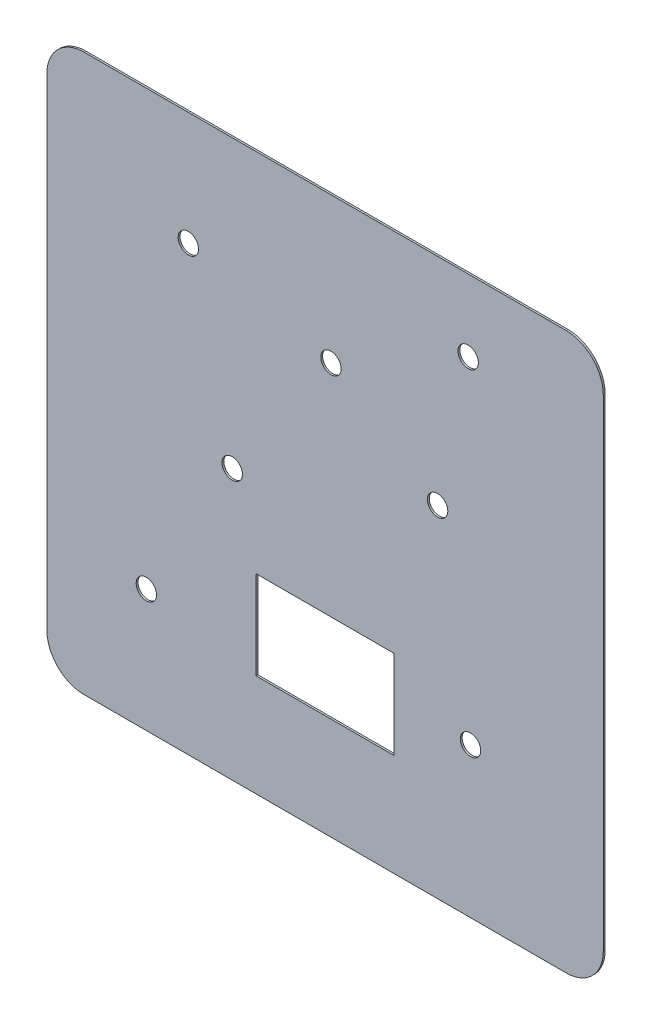
ISO-10303-21;
HEADER;
FILE_DESCRIPTION(('STEP AP214'),'2;1');
FILE_NAME('part.step','',(''),(''),'','','');
FILE_SCHEMA(('AUTOMOTIVE_DESIGN { 1 0 10303 214 1 1 1 1 }'));
ENDSEC;
DATA;
#1=APPLICATION_CONTEXT('core data for automotive mechanical design processes');
#2=APPLICATION_PROTOCOL_DEFINITION('international standard','automotive_design',2000,#1);
#3=PRODUCT_CONTEXT('',#1,'mechanical');
#4=PRODUCT('Part','Part','',(#3));
#5=PRODUCT_RELATED_PRODUCT_CATEGORY('part','',(#4));
#6=PRODUCT_DEFINITION_FORMATION('','',#4);
#7=PRODUCT_DEFINITION_CONTEXT('part definition',#1,'design');
#8=PRODUCT_DEFINITION('design','',#6,#7);
#9=PRODUCT_DEFINITION_SHAPE('','',#8);
#10=(LENGTH_UNIT() NAMED_UNIT(*) SI_UNIT(.MILLI.,.METRE.));
#11=(NAMED_UNIT(*) PLANE_ANGLE_UNIT() SI_UNIT($,.RADIAN.));
#12=(NAMED_UNIT(*) SI_UNIT($,.STERADIAN.) SOLID_ANGLE_UNIT());
#13=UNCERTAINTY_MEASURE_WITH_UNIT(LENGTH_MEASURE(1.E-05),#10,'distance_accuracy_value','');
#14=(GEOMETRIC_REPRESENTATION_CONTEXT(3) GLOBAL_UNCERTAINTY_ASSIGNED_CONTEXT((#13)) GLOBAL_UNIT_ASSIGNED_CONTEXT((#10,
#11,#12)) REPRESENTATION_CONTEXT('',''));
#15=CARTESIAN_POINT('',(0.,0.,0.));
#16=DIRECTION('',(0.,0.,1.));
#17=DIRECTION('',(1.,0.,0.));
#18=AXIS2_PLACEMENT_3D('',#15,#16,#17);
#19=CARTESIAN_POINT('',(75.,75.,0.5));
#20=DIRECTION('',(-1.,0.,0.));
#21=DIRECTION('',(0.,-1.,0.));
#22=AXIS2_PLACEMENT_3D('',#19,#20,#21);
#23=PLANE('',#22);
#24=DIRECTION('',(0.,1.,0.));
#25=VECTOR('',#24,1.);
#26=CARTESIAN_POINT('',(75.,75.,0.5));
#27=LINE('',#26,#25);
#28=CARTESIAN_POINT('',(75.,-65.,0.5));
#29=VERTEX_POINT('',#28);
#30=CARTESIAN_POINT('',(75.,65.,0.5));
#31=VERTEX_POINT('',#30);
#32=EDGE_CURVE('E221',#29,#31,#27,.T.);
#33=ORIENTED_EDGE('',*,*,#32,.F.);
#34=DIRECTION('',(0.,0.,-1.));
#35=VECTOR('',#34,1.);
#36=CARTESIAN_POINT('',(75.,-65.,0.5));
#37=LINE('',#36,#35);
#38=CARTESIAN_POINT('',(75.,-65.,0.));
#39=VERTEX_POINT('',#38);
#40=EDGE_CURVE('E255',#29,#39,#37,.T.);
#41=ORIENTED_EDGE('',*,*,#40,.T.);
#42=DIRECTION('',(0.,1.,0.));
#43=VECTOR('',#42,1.);
#44=CARTESIAN_POINT('',(75.,75.,0.));
#45=LINE('',#44,#43);
#46=CARTESIAN_POINT('',(75.,65.,0.));
#47=VERTEX_POINT('',#46);
#48=EDGE_CURVE('E220',#39,#47,#45,.T.);
#49=ORIENTED_EDGE('',*,*,#48,.T.);
#50=DIRECTION('',(0.,0.,-1.));
#51=VECTOR('',#50,1.);
#52=CARTESIAN_POINT('',(75.,65.,0.5));
#53=LINE('',#52,#51);
#54=EDGE_CURVE('E238',#47,#31,#53,.F.);
#55=ORIENTED_EDGE('',*,*,#54,.T.);
#56=EDGE_LOOP('',(#33,#41,#49,#55));
#57=FACE_BOUND('',#56,.T.);
#58=ADVANCED_FACE('F39',(#57),#23,.F.);
#59=CARTESIAN_POINT('',(-75.,75.,0.5));
#60=DIRECTION('',(0.,-1.,0.));
#61=DIRECTION('',(0.,0.,-1.));
#62=AXIS2_PLACEMENT_3D('',#59,#60,#61);
#63=PLANE('',#62);
#64=DIRECTION('',(-1.,0.,0.));
#65=VECTOR('',#64,1.);
#66=CARTESIAN_POINT('',(-75.,75.,0.));
#67=LINE('',#66,#65);
#68=CARTESIAN_POINT('',(65.,75.,0.));
#69=VERTEX_POINT('',#68);
#70=CARTESIAN_POINT('',(-65.,75.,0.));
#71=VERTEX_POINT('',#70);
#72=EDGE_CURVE('E242',#69,#71,#67,.T.);
#73=ORIENTED_EDGE('',*,*,#72,.T.);
#74=DIRECTION('',(0.,0.,-1.));
#75=VECTOR('',#74,1.);
#76=CARTESIAN_POINT('',(-65.,75.,0.5));
#77=LINE('',#76,#75);
#78=CARTESIAN_POINT('',(-65.,75.,0.5));
#79=VERTEX_POINT('',#78);
#80=EDGE_CURVE('E301',#71,#79,#77,.F.);
#81=ORIENTED_EDGE('',*,*,#80,.T.);
#82=DIRECTION('',(-1.,0.,0.));
#83=VECTOR('',#82,1.);
#84=CARTESIAN_POINT('',(-75.,75.,0.5));
#85=LINE('',#84,#83);
#86=CARTESIAN_POINT('',(65.,75.,0.5));
#87=VERTEX_POINT('',#86);
#88=EDGE_CURVE('E225',#87,#79,#85,.T.);
#89=ORIENTED_EDGE('',*,*,#88,.F.);
#90=DIRECTION('',(0.,0.,-1.));
#91=VECTOR('',#90,1.);
#92=CARTESIAN_POINT('',(65.,75.,0.5));
#93=LINE('',#92,#91);
#94=EDGE_CURVE('E297',#87,#69,#93,.T.);
#95=ORIENTED_EDGE('',*,*,#94,.T.);
#96=EDGE_LOOP('',(#73,#81,#89,#95));
#97=FACE_BOUND('',#96,.T.);
#98=ADVANCED_FACE('F330',(#97),#63,.F.);
#99=CARTESIAN_POINT('',(-75.,75.,0.5));
#100=DIRECTION('',(1.,0.,0.));
#101=DIRECTION('',(0.,0.,-1.));
#102=AXIS2_PLACEMENT_3D('',#99,#100,#101);
#103=PLANE('',#102);
#104=DIRECTION('',(0.,-1.,0.));
#105=VECTOR('',#104,1.);
#106=CARTESIAN_POINT('',(-75.,75.,0.));
#107=LINE('',#106,#105);
#108=CARTESIAN_POINT('',(-75.,65.,0.));
#109=VERTEX_POINT('',#108);
#110=CARTESIAN_POINT('',(-75.,-65.,0.));
#111=VERTEX_POINT('',#110);
#112=EDGE_CURVE('E246',#109,#111,#107,.T.);
#113=ORIENTED_EDGE('',*,*,#112,.T.);
#114=DIRECTION('',(0.,0.,-1.));
#115=VECTOR('',#114,1.);
#116=CARTESIAN_POINT('',(-75.,-65.,0.5));
#117=LINE('',#116,#115);
#118=CARTESIAN_POINT('',(-75.,-65.,0.5));
#119=VERTEX_POINT('',#118);
#120=EDGE_CURVE('E294',#111,#119,#117,.F.);
#121=ORIENTED_EDGE('',*,*,#120,.T.);
#122=DIRECTION('',(0.,-1.,0.));
#123=VECTOR('',#122,1.);
#124=CARTESIAN_POINT('',(-75.,75.,0.5));
#125=LINE('',#124,#123);
#126=CARTESIAN_POINT('',(-75.,65.,0.5));
#127=VERTEX_POINT('',#126);
#128=EDGE_CURVE('E230',#127,#119,#125,.T.);
#129=ORIENTED_EDGE('',*,*,#128,.F.);
#130=DIRECTION('',(0.,0.,-1.));
#131=VECTOR('',#130,1.);
#132=CARTESIAN_POINT('',(-75.,65.,0.5));
#133=LINE('',#132,#131);
#134=EDGE_CURVE('E290',#127,#109,#133,.T.);
#135=ORIENTED_EDGE('',*,*,#134,.T.);
#136=EDGE_LOOP('',(#113,#121,#129,#135));
#137=FACE_BOUND('',#136,.T.);
#138=ADVANCED_FACE('F336',(#137),#103,.F.);
#139=CARTESIAN_POINT('',(-75.,-75.,0.5));
#140=DIRECTION('',(0.,1.,0.));
#141=DIRECTION('',(0.,0.,1.));
#142=AXIS2_PLACEMENT_3D('',#139,#140,#141);
#143=PLANE('',#142);
#144=DIRECTION('',(1.,0.,0.));
#145=VECTOR('',#144,1.);
#146=CARTESIAN_POINT('',(-75.,-75.,0.));
#147=LINE('',#146,#145);
#148=CARTESIAN_POINT('',(-65.,-75.,0.));
#149=VERTEX_POINT('',#148);
#150=CARTESIAN_POINT('',(65.,-75.,0.));
#151=VERTEX_POINT('',#150);
#152=EDGE_CURVE('E226',#149,#151,#147,.T.);
#153=ORIENTED_EDGE('',*,*,#152,.T.);
#154=DIRECTION('',(0.,0.,-1.));
#155=VECTOR('',#154,1.);
#156=CARTESIAN_POINT('',(65.,-75.,0.5));
#157=LINE('',#156,#155);
#158=CARTESIAN_POINT('',(65.,-75.,0.5));
#159=VERTEX_POINT('',#158);
#160=EDGE_CURVE('E275',#151,#159,#157,.F.);
#161=ORIENTED_EDGE('',*,*,#160,.T.);
#162=DIRECTION('',(1.,0.,0.));
#163=VECTOR('',#162,1.);
#164=CARTESIAN_POINT('',(-75.,-75.,0.5));
#165=LINE('',#164,#163);
#166=CARTESIAN_POINT('',(-65.,-75.,0.5));
#167=VERTEX_POINT('',#166);
#168=EDGE_CURVE('E234',#167,#159,#165,.T.);
#169=ORIENTED_EDGE('',*,*,#168,.F.);
#170=DIRECTION('',(0.,0.,-1.));
#171=VECTOR('',#170,1.);
#172=CARTESIAN_POINT('',(-65.,-75.,0.5));
#173=LINE('',#172,#171);
#174=EDGE_CURVE('E271',#167,#149,#173,.T.);
#175=ORIENTED_EDGE('',*,*,#174,.T.);
#176=EDGE_LOOP('',(#153,#161,#169,#175));
#177=FACE_BOUND('',#176,.T.);
#178=ADVANCED_FACE('F371',(#177),#143,.F.);
#179=CARTESIAN_POINT('',(0.,0.,0.5));
#180=DIRECTION('',(0.,0.,1.));
#181=DIRECTION('',(1.,0.,0.));
#182=AXIS2_PLACEMENT_3D('',#179,#180,#181);
#183=PLANE('',#182);
#184=DIRECTION('',(0.,1.,0.));
#185=VECTOR('',#184,1.);
#186=CARTESIAN_POINT('',(18.5921824981392,-47.4298792805712,0.5));
#187=LINE('',#186,#185);
#188=CARTESIAN_POINT('',(18.5921824981392,-47.4298792805712,0.5));
#189=VERTEX_POINT('',#188);
#190=CARTESIAN_POINT('',(18.5921824981392,-23.5807429139641,0.5));
#191=VERTEX_POINT('',#190);
#192=EDGE_CURVE('E55',#189,#191,#187,.T.);
#193=ORIENTED_EDGE('',*,*,#192,.F.);
#194=DIRECTION('',(1.,0.,0.));
#195=VECTOR('',#194,1.);
#196=CARTESIAN_POINT('',(-18.5921824981392,-47.4298792805712,0.5));
#197=LINE('',#196,#195);
#198=CARTESIAN_POINT('',(-18.5921824981392,-47.4298792805712,0.5));
#199=VERTEX_POINT('',#198);
#200=EDGE_CURVE('E150',#199,#189,#197,.T.);
#201=ORIENTED_EDGE('',*,*,#200,.F.);
#202=DIRECTION('',(0.,-1.,0.));
#203=VECTOR('',#202,1.);
#204=CARTESIAN_POINT('',(-18.5921824981392,-47.4298792805712,0.5));
#205=LINE('',#204,#203);
#206=CARTESIAN_POINT('',(-18.5921824981392,-23.5807429139641,0.5));
#207=VERTEX_POINT('',#206);
#208=EDGE_CURVE('E132',#207,#199,#205,.T.);
#209=ORIENTED_EDGE('',*,*,#208,.F.);
#210=DIRECTION('',(-1.,0.,0.));
#211=VECTOR('',#210,1.);
#212=CARTESIAN_POINT('',(-18.5921824981392,-23.5807429139641,0.5));
#213=LINE('',#212,#211);
#214=EDGE_CURVE('E142',#191,#207,#213,.T.);
#215=ORIENTED_EDGE('',*,*,#214,.F.);
#216=EDGE_LOOP('',(#193,#201,#209,#215));
#217=FACE_BOUND('',#216,.T.);
#218=CARTESIAN_POINT('',(-48.1796937595207,-41.9661545299378,0.500000000000001));
#219=DIRECTION('',(0.,0.,1.));
#220=DIRECTION('',(1.,0.,0.));
#221=AXIS2_PLACEMENT_3D('',#218,#219,#220);
#222=CIRCLE('',#221,2.75);
#223=CARTESIAN_POINT('',(-45.4296937595207,-41.9661545299378,0.500000000000001));
#224=VERTEX_POINT('',#223);
#225=EDGE_CURVE('E160',#224,#224,#222,.T.);
#226=ORIENTED_EDGE('',*,*,#225,.F.);
#227=EDGE_LOOP('',(#226));
#228=FACE_BOUND('',#227,.T.);
#229=CARTESIAN_POINT('',(-25.0340979424366,-2.22101942156186,0.500000000000001));
#230=DIRECTION('',(0.,0.,1.));
#231=DIRECTION('',(1.,0.,0.));
#232=AXIS2_PLACEMENT_3D('',#229,#230,#231);
#233=CIRCLE('',#232,2.75);
#234=CARTESIAN_POINT('',(-22.2840979424366,-2.22101942156186,0.500000000000001));
#235=VERTEX_POINT('',#234);
#236=EDGE_CURVE('E172',#235,#235,#233,.T.);
#237=ORIENTED_EDGE('',*,*,#236,.F.);
#238=EDGE_LOOP('',(#237));
#239=FACE_BOUND('',#238,.T.);
#240=CARTESIAN_POINT('',(30.3364611623649,16.858043097251,0.500000000000001));
#241=DIRECTION('',(0.,0.,1.));
#242=DIRECTION('',(1.,0.,0.));
#243=AXIS2_PLACEMENT_3D('',#240,#241,#242);
#244=CIRCLE('',#243,2.75);
#245=CARTESIAN_POINT('',(33.0864611623649,16.858043097251,0.500000000000001));
#246=VERTEX_POINT('',#245);
#247=EDGE_CURVE('E180',#246,#246,#244,.T.);
#248=ORIENTED_EDGE('',*,*,#247,.F.);
#249=EDGE_LOOP('',(#248));
#250=FACE_BOUND('',#249,.T.);
#251=CARTESIAN_POINT('',(39.210967362949,-34.6065465610296,0.500000000000001));
#252=DIRECTION('',(0.,0.,1.));
#253=DIRECTION('',(1.,0.,0.));
#254=AXIS2_PLACEMENT_3D('',#251,#252,#253);
#255=CIRCLE('',#254,2.75);
#256=CARTESIAN_POINT('',(41.960967362949,-34.6065465610296,0.500000000000001));
#257=VERTEX_POINT('',#256);
#258=EDGE_CURVE('E188',#257,#257,#255,.T.);
#259=ORIENTED_EDGE('',*,*,#258,.F.);
#260=EDGE_LOOP('',(#259));
#261=FACE_BOUND('',#260,.T.);
#262=CARTESIAN_POINT('',(-36.8661176924818,44.4433466472346,0.500000000000001));
#263=DIRECTION('',(0.,0.,1.));
#264=DIRECTION('',(1.,0.,0.));
#265=AXIS2_PLACEMENT_3D('',#262,#263,#264);
#266=CIRCLE('',#265,2.75);
#267=CARTESIAN_POINT('',(-34.1161176924819,44.4433466472346,0.500000000000001));
#268=VERTEX_POINT('',#267);
#269=EDGE_CURVE('E196',#268,#268,#266,.T.);
#270=ORIENTED_EDGE('',*,*,#269,.F.);
#271=EDGE_LOOP('',(#270));
#272=FACE_BOUND('',#271,.T.);
#273=CARTESIAN_POINT('',(38.5847843878379,55.638432616753,0.500000000000001));
#274=DIRECTION('',(0.,0.,1.));
#275=DIRECTION('',(1.,0.,0.));
#276=AXIS2_PLACEMENT_3D('',#273,#274,#275);
#277=CIRCLE('',#276,2.75);
#278=CARTESIAN_POINT('',(41.3347843878379,55.638432616753,0.500000000000001));
#279=VERTEX_POINT('',#278);
#280=EDGE_CURVE('E204',#279,#279,#277,.T.);
#281=ORIENTED_EDGE('',*,*,#280,.F.);
#282=EDGE_LOOP('',(#281));
#283=FACE_BOUND('',#282,.T.);
#284=CARTESIAN_POINT('',(1.58293415168618,35.7251932066232,0.500000000000001));
#285=DIRECTION('',(0.,0.,1.));
#286=DIRECTION('',(1.,0.,0.));
#287=AXIS2_PLACEMENT_3D('',#284,#285,#286);
#288=CIRCLE('',#287,2.75);
#289=CARTESIAN_POINT('',(4.33293415168618,35.7251932066232,0.500000000000001));
#290=VERTEX_POINT('',#289);
#291=EDGE_CURVE('E212',#290,#290,#288,.T.);
#292=ORIENTED_EDGE('',*,*,#291,.F.);
#293=EDGE_LOOP('',(#292));
#294=FACE_BOUND('',#293,.T.);
#295=ORIENTED_EDGE('',*,*,#168,.T.);
#296=CARTESIAN_POINT('',(65.,-65.,0.5));
#297=DIRECTION('',(0.,0.,1.));
#298=DIRECTION('',(1.,0.,0.));
#299=AXIS2_PLACEMENT_3D('',#296,#297,#298);
#300=CIRCLE('',#299,10.);
#301=EDGE_CURVE('E287',#159,#29,#300,.T.);
#302=ORIENTED_EDGE('',*,*,#301,.T.);
#303=ORIENTED_EDGE('',*,*,#32,.T.);
#304=CARTESIAN_POINT('',(65.,65.,0.5));
#305=DIRECTION('',(0.,0.,1.));
#306=DIRECTION('',(1.,0.,0.));
#307=AXIS2_PLACEMENT_3D('',#304,#305,#306);
#308=CIRCLE('',#307,10.);
#309=EDGE_CURVE('E278',#31,#87,#308,.T.);
#310=ORIENTED_EDGE('',*,*,#309,.T.);
#311=ORIENTED_EDGE('',*,*,#88,.T.);
#312=CARTESIAN_POINT('',(-65.,65.,0.5));
#313=DIRECTION('',(0.,0.,1.));
#314=DIRECTION('',(1.,0.,0.));
#315=AXIS2_PLACEMENT_3D('',#312,#313,#314);
#316=CIRCLE('',#315,10.);
#317=EDGE_CURVE('E281',#79,#127,#316,.T.);
#318=ORIENTED_EDGE('',*,*,#317,.T.);
#319=ORIENTED_EDGE('',*,*,#128,.T.);
#320=CARTESIAN_POINT('',(-65.,-65.,0.5));
#321=DIRECTION('',(0.,0.,1.));
#322=DIRECTION('',(1.,0.,0.));
#323=AXIS2_PLACEMENT_3D('',#320,#321,#322);
#324=CIRCLE('',#323,10.);
#325=EDGE_CURVE('E284',#119,#167,#324,.T.);
#326=ORIENTED_EDGE('',*,*,#325,.T.);
#327=EDGE_LOOP('',(#295,#302,#303,#310,#311,#318,#319,#326));
#328=FACE_BOUND('',#327,.T.);
#329=ADVANCED_FACE('F147',(#217,#228,#239,#250,#261,#272,#283,#294,#328),#183,.T.);
#330=CARTESIAN_POINT('',(0.,0.,0.));
#331=DIRECTION('',(0.,0.,1.));
#332=DIRECTION('',(1.,0.,0.));
#333=AXIS2_PLACEMENT_3D('',#330,#331,#332);
#334=PLANE('',#333);
#335=DIRECTION('',(1.,0.,0.));
#336=VECTOR('',#335,1.);
#337=CARTESIAN_POINT('',(0.,-47.4298792805712,0.));
#338=LINE('',#337,#336);
#339=CARTESIAN_POINT('',(-18.5921824981392,-47.4298792805712,0.));
#340=VERTEX_POINT('',#339);
#341=CARTESIAN_POINT('',(18.5921824981392,-47.4298792805712,0.));
#342=VERTEX_POINT('',#341);
#343=EDGE_CURVE('E48',#340,#342,#338,.T.);
#344=ORIENTED_EDGE('',*,*,#343,.T.);
#345=DIRECTION('',(0.,1.,0.));
#346=VECTOR('',#345,1.);
#347=CARTESIAN_POINT('',(18.5921824981392,0.,0.));
#348=LINE('',#347,#346);
#349=CARTESIAN_POINT('',(18.5921824981392,-23.5807429139641,0.));
#350=VERTEX_POINT('',#349);
#351=EDGE_CURVE('E11',#342,#350,#348,.T.);
#352=ORIENTED_EDGE('',*,*,#351,.T.);
#353=DIRECTION('',(-1.,0.,0.));
#354=VECTOR('',#353,1.);
#355=CARTESIAN_POINT('',(0.,-23.5807429139641,0.));
#356=LINE('',#355,#354);
#357=CARTESIAN_POINT('',(-18.5921824981392,-23.5807429139641,0.));
#358=VERTEX_POINT('',#357);
#359=EDGE_CURVE('E304',#350,#358,#356,.T.);
#360=ORIENTED_EDGE('',*,*,#359,.T.);
#361=DIRECTION('',(0.,-1.,0.));
#362=VECTOR('',#361,1.);
#363=CARTESIAN_POINT('',(-18.5921824981392,0.,0.));
#364=LINE('',#363,#362);
#365=EDGE_CURVE('E135',#358,#340,#364,.T.);
#366=ORIENTED_EDGE('',*,*,#365,.T.);
#367=EDGE_LOOP('',(#344,#352,#360,#366));
#368=FACE_BOUND('',#367,.T.);
#369=CARTESIAN_POINT('',(-48.1796937595207,-41.9661545299378,0.));
#370=DIRECTION('',(0.,0.,1.));
#371=DIRECTION('',(1.,0.,0.));
#372=AXIS2_PLACEMENT_3D('',#369,#370,#371);
#373=CIRCLE('',#372,2.75);
#374=CARTESIAN_POINT('',(-45.4296937595207,-41.9661545299378,0.));
#375=VERTEX_POINT('',#374);
#376=EDGE_CURVE('E168',#375,#375,#373,.T.);
#377=ORIENTED_EDGE('',*,*,#376,.T.);
#378=EDGE_LOOP('',(#377));
#379=FACE_BOUND('',#378,.T.);
#380=CARTESIAN_POINT('',(-25.0340979424366,-2.22101942156186,0.));
#381=DIRECTION('',(0.,0.,1.));
#382=DIRECTION('',(1.,0.,0.));
#383=AXIS2_PLACEMENT_3D('',#380,#381,#382);
#384=CIRCLE('',#383,2.75);
#385=CARTESIAN_POINT('',(-22.2840979424366,-2.22101942156186,0.));
#386=VERTEX_POINT('',#385);
#387=EDGE_CURVE('E176',#386,#386,#384,.T.);
#388=ORIENTED_EDGE('',*,*,#387,.T.);
#389=EDGE_LOOP('',(#388));
#390=FACE_BOUND('',#389,.T.);
#391=CARTESIAN_POINT('',(30.3364611623649,16.858043097251,0.));
#392=DIRECTION('',(0.,0.,1.));
#393=DIRECTION('',(1.,0.,0.));
#394=AXIS2_PLACEMENT_3D('',#391,#392,#393);
#395=CIRCLE('',#394,2.75);
#396=CARTESIAN_POINT('',(33.0864611623649,16.858043097251,0.));
#397=VERTEX_POINT('',#396);
#398=EDGE_CURVE('E184',#397,#397,#395,.T.);
#399=ORIENTED_EDGE('',*,*,#398,.T.);
#400=EDGE_LOOP('',(#399));
#401=FACE_BOUND('',#400,.T.);
#402=CARTESIAN_POINT('',(39.210967362949,-34.6065465610296,0.));
#403=DIRECTION('',(0.,0.,1.));
#404=DIRECTION('',(1.,0.,0.));
#405=AXIS2_PLACEMENT_3D('',#402,#403,#404);
#406=CIRCLE('',#405,2.75);
#407=CARTESIAN_POINT('',(41.960967362949,-34.6065465610296,0.));
#408=VERTEX_POINT('',#407);
#409=EDGE_CURVE('E192',#408,#408,#406,.T.);
#410=ORIENTED_EDGE('',*,*,#409,.T.);
#411=EDGE_LOOP('',(#410));
#412=FACE_BOUND('',#411,.T.);
#413=CARTESIAN_POINT('',(-36.8661176924818,44.4433466472346,0.));
#414=DIRECTION('',(0.,0.,1.));
#415=DIRECTION('',(1.,0.,0.));
#416=AXIS2_PLACEMENT_3D('',#413,#414,#415);
#417=CIRCLE('',#416,2.75);
#418=CARTESIAN_POINT('',(-34.1161176924818,44.4433466472346,0.));
#419=VERTEX_POINT('',#418);
#420=EDGE_CURVE('E200',#419,#419,#417,.T.);
#421=ORIENTED_EDGE('',*,*,#420,.T.);
#422=EDGE_LOOP('',(#421));
#423=FACE_BOUND('',#422,.T.);
#424=CARTESIAN_POINT('',(38.5847843878379,55.638432616753,0.));
#425=DIRECTION('',(0.,0.,1.));
#426=DIRECTION('',(1.,0.,0.));
#427=AXIS2_PLACEMENT_3D('',#424,#425,#426);
#428=CIRCLE('',#427,2.75);
#429=CARTESIAN_POINT('',(41.3347843878379,55.638432616753,0.));
#430=VERTEX_POINT('',#429);
#431=EDGE_CURVE('E208',#430,#430,#428,.T.);
#432=ORIENTED_EDGE('',*,*,#431,.T.);
#433=EDGE_LOOP('',(#432));
#434=FACE_BOUND('',#433,.T.);
#435=CARTESIAN_POINT('',(1.58293415168618,35.7251932066232,0.));
#436=DIRECTION('',(0.,0.,1.));
#437=DIRECTION('',(1.,0.,0.));
#438=AXIS2_PLACEMENT_3D('',#435,#436,#437);
#439=CIRCLE('',#438,2.75);
#440=CARTESIAN_POINT('',(4.33293415168618,35.7251932066232,0.));
#441=VERTEX_POINT('',#440);
#442=EDGE_CURVE('E216',#441,#441,#439,.T.);
#443=ORIENTED_EDGE('',*,*,#442,.T.);
#444=EDGE_LOOP('',(#443));
#445=FACE_BOUND('',#444,.T.);
#446=ORIENTED_EDGE('',*,*,#48,.F.);
#447=CARTESIAN_POINT('',(65.,-65.,0.));
#448=DIRECTION('',(0.,0.,1.));
#449=DIRECTION('',(1.,0.,0.));
#450=AXIS2_PLACEMENT_3D('',#447,#448,#449);
#451=CIRCLE('',#450,10.);
#452=EDGE_CURVE('E268',#39,#151,#451,.F.);
#453=ORIENTED_EDGE('',*,*,#452,.T.);
#454=ORIENTED_EDGE('',*,*,#152,.F.);
#455=CARTESIAN_POINT('',(-65.,-65.,0.));
#456=DIRECTION('',(0.,0.,1.));
#457=DIRECTION('',(1.,0.,0.));
#458=AXIS2_PLACEMENT_3D('',#455,#456,#457);
#459=CIRCLE('',#458,10.);
#460=EDGE_CURVE('E265',#149,#111,#459,.F.);
#461=ORIENTED_EDGE('',*,*,#460,.T.);
#462=ORIENTED_EDGE('',*,*,#112,.F.);
#463=CARTESIAN_POINT('',(-65.,65.,0.));
#464=DIRECTION('',(0.,0.,1.));
#465=DIRECTION('',(1.,0.,0.));
#466=AXIS2_PLACEMENT_3D('',#463,#464,#465);
#467=CIRCLE('',#466,10.);
#468=EDGE_CURVE('E262',#109,#71,#467,.F.);
#469=ORIENTED_EDGE('',*,*,#468,.T.);
#470=ORIENTED_EDGE('',*,*,#72,.F.);
#471=CARTESIAN_POINT('',(65.,65.,0.));
#472=DIRECTION('',(0.,0.,1.));
#473=DIRECTION('',(1.,0.,0.));
#474=AXIS2_PLACEMENT_3D('',#471,#472,#473);
#475=CIRCLE('',#474,10.);
#476=EDGE_CURVE('E259',#69,#47,#475,.F.);
#477=ORIENTED_EDGE('',*,*,#476,.T.);
#478=EDGE_LOOP('',(#446,#453,#454,#461,#462,#469,#470,#477));
#479=FACE_BOUND('',#478,.T.);
#480=ADVANCED_FACE('F311',(#368,#379,#390,#401,#412,#423,#434,#445,#479),#334,.F.);
#481=CARTESIAN_POINT('',(65.,-65.,0.5));
#482=DIRECTION('',(0.,0.,-1.));
#483=DIRECTION('',(-1.,0.,0.));
#484=AXIS2_PLACEMENT_3D('',#481,#482,#483);
#485=CYLINDRICAL_SURFACE('',#484,10.);
#486=ORIENTED_EDGE('',*,*,#301,.F.);
#487=ORIENTED_EDGE('',*,*,#160,.F.);
#488=ORIENTED_EDGE('',*,*,#452,.F.);
#489=ORIENTED_EDGE('',*,*,#40,.F.);
#490=EDGE_LOOP('',(#486,#487,#488,#489));
#491=FACE_BOUND('',#490,.T.);
#492=ADVANCED_FACE('F342',(#491),#485,.T.);
#493=CARTESIAN_POINT('',(-65.,-65.,0.5));
#494=DIRECTION('',(0.,0.,-1.));
#495=DIRECTION('',(-1.,0.,0.));
#496=AXIS2_PLACEMENT_3D('',#493,#494,#495);
#497=CYLINDRICAL_SURFACE('',#496,10.);
#498=ORIENTED_EDGE('',*,*,#325,.F.);
#499=ORIENTED_EDGE('',*,*,#120,.F.);
#500=ORIENTED_EDGE('',*,*,#460,.F.);
#501=ORIENTED_EDGE('',*,*,#174,.F.);
#502=EDGE_LOOP('',(#498,#499,#500,#501));
#503=FACE_BOUND('',#502,.T.);
#504=ADVANCED_FACE('F345',(#503),#497,.T.);
#505=CARTESIAN_POINT('',(-65.,65.,0.5));
#506=DIRECTION('',(0.,0.,-1.));
#507=DIRECTION('',(-1.,0.,0.));
#508=AXIS2_PLACEMENT_3D('',#505,#506,#507);
#509=CYLINDRICAL_SURFACE('',#508,10.);
#510=ORIENTED_EDGE('',*,*,#317,.F.);
#511=ORIENTED_EDGE('',*,*,#80,.F.);
#512=ORIENTED_EDGE('',*,*,#468,.F.);
#513=ORIENTED_EDGE('',*,*,#134,.F.);
#514=EDGE_LOOP('',(#510,#511,#512,#513));
#515=FACE_BOUND('',#514,.T.);
#516=ADVANCED_FACE('F348',(#515),#509,.T.);
#517=CARTESIAN_POINT('',(65.,65.,0.5));
#518=DIRECTION('',(0.,0.,-1.));
#519=DIRECTION('',(-1.,0.,0.));
#520=AXIS2_PLACEMENT_3D('',#517,#518,#519);
#521=CYLINDRICAL_SURFACE('',#520,10.);
#522=ORIENTED_EDGE('',*,*,#309,.F.);
#523=ORIENTED_EDGE('',*,*,#54,.F.);
#524=ORIENTED_EDGE('',*,*,#476,.F.);
#525=ORIENTED_EDGE('',*,*,#94,.F.);
#526=EDGE_LOOP('',(#522,#523,#524,#525));
#527=FACE_BOUND('',#526,.T.);
#528=ADVANCED_FACE('F41',(#527),#521,.T.);
#529=CARTESIAN_POINT('',(1.58293415168618,35.7251932066232,0.5));
#530=DIRECTION('',(0.,0.,1.));
#531=DIRECTION('',(1.,0.,0.));
#532=AXIS2_PLACEMENT_3D('',#529,#530,#531);
#533=CYLINDRICAL_SURFACE('',#532,2.75);
#534=ORIENTED_EDGE('',*,*,#442,.F.);
#535=EDGE_LOOP('',(#534));
#536=FACE_BOUND('',#535,.T.);
#537=ORIENTED_EDGE('',*,*,#291,.T.);
#538=EDGE_LOOP('',(#537));
#539=FACE_BOUND('',#538,.T.);
#540=ADVANCED_FACE('F355',(#536,#539),#533,.F.);
#541=CARTESIAN_POINT('',(38.5847843878379,55.638432616753,0.5));
#542=DIRECTION('',(0.,0.,1.));
#543=DIRECTION('',(1.,0.,0.));
#544=AXIS2_PLACEMENT_3D('',#541,#542,#543);
#545=CYLINDRICAL_SURFACE('',#544,2.75);
#546=ORIENTED_EDGE('',*,*,#431,.F.);
#547=EDGE_LOOP('',(#546));
#548=FACE_BOUND('',#547,.T.);
#549=ORIENTED_EDGE('',*,*,#280,.T.);
#550=EDGE_LOOP('',(#549));
#551=FACE_BOUND('',#550,.T.);
#552=ADVANCED_FACE('F476',(#548,#551),#545,.F.);
#553=CARTESIAN_POINT('',(-36.8661176924818,44.4433466472346,0.5));
#554=DIRECTION('',(0.,0.,1.));
#555=DIRECTION('',(1.,0.,0.));
#556=AXIS2_PLACEMENT_3D('',#553,#554,#555);
#557=CYLINDRICAL_SURFACE('',#556,2.75);
#558=ORIENTED_EDGE('',*,*,#420,.F.);
#559=EDGE_LOOP('',(#558));
#560=FACE_BOUND('',#559,.T.);
#561=ORIENTED_EDGE('',*,*,#269,.T.);
#562=EDGE_LOOP('',(#561));
#563=FACE_BOUND('',#562,.T.);
#564=ADVANCED_FACE('F467',(#560,#563),#557,.F.);
#565=CARTESIAN_POINT('',(39.210967362949,-34.6065465610296,0.5));
#566=DIRECTION('',(0.,0.,1.));
#567=DIRECTION('',(1.,0.,0.));
#568=AXIS2_PLACEMENT_3D('',#565,#566,#567);
#569=CYLINDRICAL_SURFACE('',#568,2.75);
#570=ORIENTED_EDGE('',*,*,#409,.F.);
#571=EDGE_LOOP('',(#570));
#572=FACE_BOUND('',#571,.T.);
#573=ORIENTED_EDGE('',*,*,#258,.T.);
#574=EDGE_LOOP('',(#573));
#575=FACE_BOUND('',#574,.T.);
#576=ADVANCED_FACE('F458',(#572,#575),#569,.F.);
#577=CARTESIAN_POINT('',(30.3364611623649,16.858043097251,0.5));
#578=DIRECTION('',(0.,0.,1.));
#579=DIRECTION('',(1.,0.,0.));
#580=AXIS2_PLACEMENT_3D('',#577,#578,#579);
#581=CYLINDRICAL_SURFACE('',#580,2.75);
#582=ORIENTED_EDGE('',*,*,#398,.F.);
#583=EDGE_LOOP('',(#582));
#584=FACE_BOUND('',#583,.T.);
#585=ORIENTED_EDGE('',*,*,#247,.T.);
#586=EDGE_LOOP('',(#585));
#587=FACE_BOUND('',#586,.T.);
#588=ADVANCED_FACE('F449',(#584,#587),#581,.F.);
#589=CARTESIAN_POINT('',(-25.0340979424366,-2.22101942156186,0.5));
#590=DIRECTION('',(0.,0.,1.));
#591=DIRECTION('',(1.,0.,0.));
#592=AXIS2_PLACEMENT_3D('',#589,#590,#591);
#593=CYLINDRICAL_SURFACE('',#592,2.75);
#594=ORIENTED_EDGE('',*,*,#387,.F.);
#595=EDGE_LOOP('',(#594));
#596=FACE_BOUND('',#595,.T.);
#597=ORIENTED_EDGE('',*,*,#236,.T.);
#598=EDGE_LOOP('',(#597));
#599=FACE_BOUND('',#598,.T.);
#600=ADVANCED_FACE('F325',(#596,#599),#593,.F.);
#601=CARTESIAN_POINT('',(-48.1796937595207,-41.9661545299378,0.5));
#602=DIRECTION('',(0.,0.,1.));
#603=DIRECTION('',(1.,0.,0.));
#604=AXIS2_PLACEMENT_3D('',#601,#602,#603);
#605=CYLINDRICAL_SURFACE('',#604,2.75);
#606=ORIENTED_EDGE('',*,*,#376,.F.);
#607=EDGE_LOOP('',(#606));
#608=FACE_BOUND('',#607,.T.);
#609=ORIENTED_EDGE('',*,*,#225,.T.);
#610=EDGE_LOOP('',(#609));
#611=FACE_BOUND('',#610,.T.);
#612=ADVANCED_FACE('F318',(#608,#611),#605,.F.);
#613=CARTESIAN_POINT('',(18.5921824981392,-47.4298792805712,-0.5));
#614=DIRECTION('',(1.,0.,0.));
#615=DIRECTION('',(0.,0.,-1.));
#616=AXIS2_PLACEMENT_3D('',#613,#614,#615);
#617=PLANE('',#616);
#618=DIRECTION('',(0.,0.,1.));
#619=VECTOR('',#618,1.);
#620=CARTESIAN_POINT('',(18.5921824981392,-47.4298792805712,-0.5));
#621=LINE('',#620,#619);
#622=EDGE_CURVE('E157',#342,#189,#621,.T.);
#623=ORIENTED_EDGE('',*,*,#622,.T.);
#624=ORIENTED_EDGE('',*,*,#192,.T.);
#625=DIRECTION('',(0.,0.,1.));
#626=VECTOR('',#625,1.);
#627=CARTESIAN_POINT('',(18.5921824981392,-23.5807429139641,-0.5));
#628=LINE('',#627,#626);
#629=EDGE_CURVE('E139',#350,#191,#628,.T.);
#630=ORIENTED_EDGE('',*,*,#629,.F.);
#631=ORIENTED_EDGE('',*,*,#351,.F.);
#632=EDGE_LOOP('',(#623,#624,#630,#631));
#633=FACE_BOUND('',#632,.T.);
#634=ADVANCED_FACE('F316',(#633),#617,.F.);
#635=CARTESIAN_POINT('',(-18.5921824981392,-47.4298792805712,-0.5));
#636=DIRECTION('',(0.,-1.,0.));
#637=DIRECTION('',(0.,0.,-1.));
#638=AXIS2_PLACEMENT_3D('',#635,#636,#637);
#639=PLANE('',#638);
#640=DIRECTION('',(0.,0.,1.));
#641=VECTOR('',#640,1.);
#642=CARTESIAN_POINT('',(-18.5921824981392,-47.4298792805712,-0.5));
#643=LINE('',#642,#641);
#644=EDGE_CURVE('E138',#340,#199,#643,.T.);
#645=ORIENTED_EDGE('',*,*,#644,.T.);
#646=ORIENTED_EDGE('',*,*,#200,.T.);
#647=ORIENTED_EDGE('',*,*,#622,.F.);
#648=ORIENTED_EDGE('',*,*,#343,.F.);
#649=EDGE_LOOP('',(#645,#646,#647,#648));
#650=FACE_BOUND('',#649,.T.);
#651=ADVANCED_FACE('F315',(#650),#639,.F.);
#652=CARTESIAN_POINT('',(-18.5921824981392,-47.4298792805712,-0.5));
#653=DIRECTION('',(-1.,0.,0.));
#654=DIRECTION('',(0.,0.,1.));
#655=AXIS2_PLACEMENT_3D('',#652,#653,#654);
#656=PLANE('',#655);
#657=DIRECTION('',(0.,0.,1.));
#658=VECTOR('',#657,1.);
#659=CARTESIAN_POINT('',(-18.5921824981392,-23.5807429139641,-0.5));
#660=LINE('',#659,#658);
#661=EDGE_CURVE('E63',#358,#207,#660,.T.);
#662=ORIENTED_EDGE('',*,*,#661,.T.);
#663=ORIENTED_EDGE('',*,*,#208,.T.);
#664=ORIENTED_EDGE('',*,*,#644,.F.);
#665=ORIENTED_EDGE('',*,*,#365,.F.);
#666=EDGE_LOOP('',(#662,#663,#664,#665));
#667=FACE_BOUND('',#666,.T.);
#668=ADVANCED_FACE('F129',(#667),#656,.F.);
#669=CARTESIAN_POINT('',(-18.5921824981392,-23.5807429139641,-0.5));
#670=DIRECTION('',(0.,1.,0.));
#671=DIRECTION('',(0.,0.,1.));
#672=AXIS2_PLACEMENT_3D('',#669,#670,#671);
#673=PLANE('',#672);
#674=ORIENTED_EDGE('',*,*,#629,.T.);
#675=ORIENTED_EDGE('',*,*,#214,.T.);
#676=ORIENTED_EDGE('',*,*,#661,.F.);
#677=ORIENTED_EDGE('',*,*,#359,.F.);
#678=EDGE_LOOP('',(#674,#675,#676,#677));
#679=FACE_BOUND('',#678,.T.);
#680=ADVANCED_FACE('F143',(#679),#673,.F.);
#681=CLOSED_SHELL('',(#58,#98,#138,#178,#329,#480,#492,#504,#516,#528,#540,#552,#564,#576,#588,
#600,#612,#634,#651,#668,#680));
#682=MANIFOLD_SOLID_BREP('B2',#681);
#683=ADVANCED_BREP_SHAPE_REPRESENTATION('',(#18,#682),#14);
#684=SHAPE_DEFINITION_REPRESENTATION(#9,#683);
ENDSEC;
END-ISO-10303-21;
